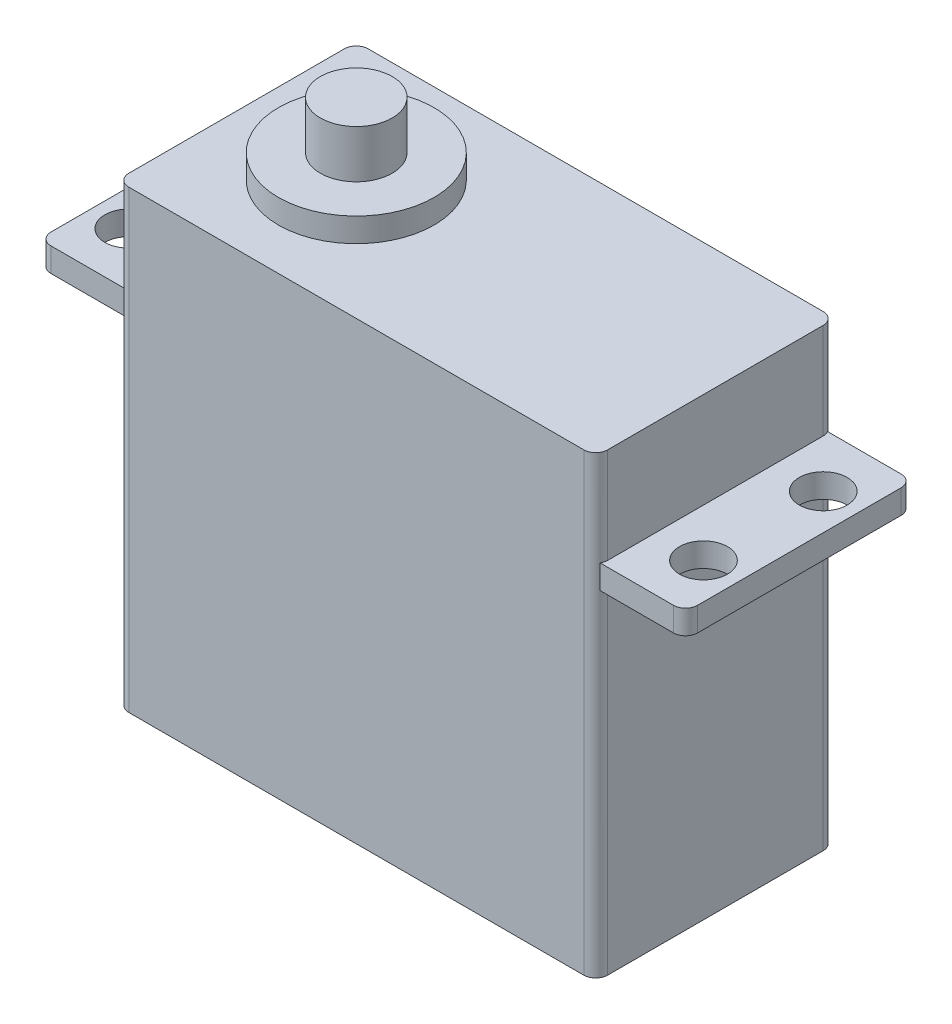
ISO-10303-21;
HEADER;
FILE_DESCRIPTION(('STEP AP214'),'2;1');
FILE_NAME('part.step','',(''),(''),'','','');
FILE_SCHEMA(('AUTOMOTIVE_DESIGN { 1 0 10303 214 1 1 1 1 }'));
ENDSEC;
DATA;
#1=APPLICATION_CONTEXT('core data for automotive mechanical design processes');
#2=APPLICATION_PROTOCOL_DEFINITION('international standard','automotive_design',2000,#1);
#3=PRODUCT_CONTEXT('',#1,'mechanical');
#4=PRODUCT('Part','Part','',(#3));
#5=PRODUCT_RELATED_PRODUCT_CATEGORY('part','',(#4));
#6=PRODUCT_DEFINITION_FORMATION('','',#4);
#7=PRODUCT_DEFINITION_CONTEXT('part definition',#1,'design');
#8=PRODUCT_DEFINITION('design','',#6,#7);
#9=PRODUCT_DEFINITION_SHAPE('','',#8);
#10=(LENGTH_UNIT() NAMED_UNIT(*) SI_UNIT(.MILLI.,.METRE.));
#11=(NAMED_UNIT(*) PLANE_ANGLE_UNIT() SI_UNIT($,.RADIAN.));
#12=(NAMED_UNIT(*) SI_UNIT($,.STERADIAN.) SOLID_ANGLE_UNIT());
#13=UNCERTAINTY_MEASURE_WITH_UNIT(LENGTH_MEASURE(1.E-05),#10,'distance_accuracy_value','');
#14=(GEOMETRIC_REPRESENTATION_CONTEXT(3) GLOBAL_UNCERTAINTY_ASSIGNED_CONTEXT((#13)) GLOBAL_UNIT_ASSIGNED_CONTEXT((#10,
#11,#12)) REPRESENTATION_CONTEXT('',''));
#15=CARTESIAN_POINT('',(0.,0.,0.));
#16=DIRECTION('',(0.,0.,1.));
#17=DIRECTION('',(1.,0.,0.));
#18=AXIS2_PLACEMENT_3D('',#15,#16,#17);
#19=CARTESIAN_POINT('',(-10.,-38.,-10.));
#20=DIRECTION('',(-1.,0.,0.));
#21=DIRECTION('',(0.,0.,1.));
#22=AXIS2_PLACEMENT_3D('',#19,#20,#21);
#23=PLANE('',#22);
#24=DIRECTION('',(0.,0.,1.));
#25=VECTOR('',#24,1.);
#26=CARTESIAN_POINT('',(-10.,-35.,-3.));
#27=LINE('',#26,#25);
#28=CARTESIAN_POINT('',(-10.,-35.,-3.));
#29=VERTEX_POINT('',#28);
#30=CARTESIAN_POINT('',(-10.,-35.,3.));
#31=VERTEX_POINT('',#30);
#32=EDGE_CURVE('E935',#29,#31,#27,.T.);
#33=ORIENTED_EDGE('',*,*,#32,.F.);
#34=DIRECTION('',(0.,-1.,0.));
#35=VECTOR('',#34,1.);
#36=CARTESIAN_POINT('',(-10.,-31.,-3.));
#37=LINE('',#36,#35);
#38=CARTESIAN_POINT('',(-10.,-31.,-3.));
#39=VERTEX_POINT('',#38);
#40=EDGE_CURVE('E241',#39,#29,#37,.T.);
#41=ORIENTED_EDGE('',*,*,#40,.F.);
#42=DIRECTION('',(0.,0.,-1.));
#43=VECTOR('',#42,1.);
#44=CARTESIAN_POINT('',(-10.,-31.,-3.));
#45=LINE('',#44,#43);
#46=CARTESIAN_POINT('',(-10.,-31.,3.00000000000001));
#47=VERTEX_POINT('',#46);
#48=EDGE_CURVE('E237',#47,#39,#45,.T.);
#49=ORIENTED_EDGE('',*,*,#48,.F.);
#50=DIRECTION('',(0.,1.,0.));
#51=VECTOR('',#50,1.);
#52=CARTESIAN_POINT('',(-10.,-31.,3.));
#53=LINE('',#52,#51);
#54=EDGE_CURVE('E933',#31,#47,#53,.T.);
#55=ORIENTED_EDGE('',*,*,#54,.F.);
#56=EDGE_LOOP('',(#33,#41,#49,#55));
#57=FACE_BOUND('',#56,.T.);
#58=DIRECTION('',(0.,0.,1.));
#59=VECTOR('',#58,1.);
#60=CARTESIAN_POINT('',(-10.,-38.,-10.));
#61=LINE('',#60,#59);
#62=CARTESIAN_POINT('',(-10.,-38.,-9.));
#63=VERTEX_POINT('',#62);
#64=CARTESIAN_POINT('',(-10.,-38.,9.));
#65=VERTEX_POINT('',#64);
#66=EDGE_CURVE('E323',#63,#65,#61,.T.);
#67=ORIENTED_EDGE('',*,*,#66,.T.);
#68=DIRECTION('',(0.,1.,0.));
#69=VECTOR('',#68,1.);
#70=CARTESIAN_POINT('',(-10.,-38.,9.));
#71=LINE('',#70,#69);
#72=CARTESIAN_POINT('',(-10.,-10.,9.));
#73=VERTEX_POINT('',#72);
#74=EDGE_CURVE('E423',#65,#73,#71,.T.);
#75=ORIENTED_EDGE('',*,*,#74,.T.);
#76=DIRECTION('',(0.,0.,1.));
#77=VECTOR('',#76,1.);
#78=CARTESIAN_POINT('',(-10.,-10.,-9.5));
#79=LINE('',#78,#77);
#80=CARTESIAN_POINT('',(-10.,-10.,-9.));
#81=VERTEX_POINT('',#80);
#82=EDGE_CURVE('E272',#81,#73,#79,.T.);
#83=ORIENTED_EDGE('',*,*,#82,.F.);
#84=DIRECTION('',(0.,1.,0.));
#85=VECTOR('',#84,1.);
#86=CARTESIAN_POINT('',(-10.,-38.,-9.));
#87=LINE('',#86,#85);
#88=EDGE_CURVE('E417',#81,#63,#87,.F.);
#89=ORIENTED_EDGE('',*,*,#88,.T.);
#90=EDGE_LOOP('',(#67,#75,#83,#89));
#91=FACE_BOUND('',#90,.T.);
#92=ADVANCED_FACE('F34',(#57,#91),#23,.T.);
#93=CARTESIAN_POINT('',(30.,-38.,-10.));
#94=DIRECTION('',(1.,0.,0.));
#95=DIRECTION('',(0.,0.,-1.));
#96=AXIS2_PLACEMENT_3D('',#93,#94,#95);
#97=PLANE('',#96);
#98=DIRECTION('',(0.,0.,-1.));
#99=VECTOR('',#98,1.);
#100=CARTESIAN_POINT('',(30.,-38.,-10.));
#101=LINE('',#100,#99);
#102=CARTESIAN_POINT('',(30.,-38.,9.));
#103=VERTEX_POINT('',#102);
#104=CARTESIAN_POINT('',(30.,-38.,-9.));
#105=VERTEX_POINT('',#104);
#106=EDGE_CURVE('E330',#103,#105,#101,.T.);
#107=ORIENTED_EDGE('',*,*,#106,.T.);
#108=DIRECTION('',(0.,1.,0.));
#109=VECTOR('',#108,1.);
#110=CARTESIAN_POINT('',(30.,-38.,-9.));
#111=LINE('',#110,#109);
#112=CARTESIAN_POINT('',(30.,-10.,-9.));
#113=VERTEX_POINT('',#112);
#114=EDGE_CURVE('E368',#105,#113,#111,.T.);
#115=ORIENTED_EDGE('',*,*,#114,.T.);
#116=DIRECTION('',(0.,0.,-1.));
#117=VECTOR('',#116,1.);
#118=CARTESIAN_POINT('',(30.,-10.,9.5));
#119=LINE('',#118,#117);
#120=CARTESIAN_POINT('',(30.,-10.,9.));
#121=VERTEX_POINT('',#120);
#122=EDGE_CURVE('E290',#121,#113,#119,.T.);
#123=ORIENTED_EDGE('',*,*,#122,.F.);
#124=DIRECTION('',(0.,1.,0.));
#125=VECTOR('',#124,1.);
#126=CARTESIAN_POINT('',(30.,-38.,9.));
#127=LINE('',#126,#125);
#128=EDGE_CURVE('E362',#121,#103,#127,.F.);
#129=ORIENTED_EDGE('',*,*,#128,.T.);
#130=EDGE_LOOP('',(#107,#115,#123,#129));
#131=FACE_BOUND('',#130,.T.);
#132=ADVANCED_FACE('F500',(#131),#97,.T.);
#133=DIRECTION('',(0.,0.,-1.));
#134=VECTOR('',#133,1.);
#135=CARTESIAN_POINT('',(-10.,-8.,-9.5));
#136=LINE('',#135,#134);
#137=CARTESIAN_POINT('',(-10.,-8.,9.00000000000001));
#138=VERTEX_POINT('',#137);
#139=CARTESIAN_POINT('',(-10.,-8.,-9.));
#140=VERTEX_POINT('',#139);
#141=EDGE_CURVE('E277',#138,#140,#136,.T.);
#142=ORIENTED_EDGE('',*,*,#141,.F.);
#143=DIRECTION('',(0.,1.,0.));
#144=VECTOR('',#143,1.);
#145=CARTESIAN_POINT('',(-10.,-38.,9.));
#146=LINE('',#145,#144);
#147=CARTESIAN_POINT('',(-10.,0.,9.));
#148=VERTEX_POINT('',#147);
#149=EDGE_CURVE('E421',#138,#148,#146,.T.);
#150=ORIENTED_EDGE('',*,*,#149,.T.);
#151=DIRECTION('',(0.,0.,1.));
#152=VECTOR('',#151,1.);
#153=CARTESIAN_POINT('',(-10.,0.,-10.));
#154=LINE('',#153,#152);
#155=CARTESIAN_POINT('',(-10.,0.,-9.));
#156=VERTEX_POINT('',#155);
#157=EDGE_CURVE('E320',#156,#148,#154,.T.);
#158=ORIENTED_EDGE('',*,*,#157,.F.);
#159=DIRECTION('',(0.,1.,0.));
#160=VECTOR('',#159,1.);
#161=CARTESIAN_POINT('',(-10.,-38.,-9.));
#162=LINE('',#161,#160);
#163=EDGE_CURVE('E419',#156,#140,#162,.F.);
#164=ORIENTED_EDGE('',*,*,#163,.T.);
#165=EDGE_LOOP('',(#142,#150,#158,#164));
#166=FACE_BOUND('',#165,.T.);
#167=ADVANCED_FACE('F503',(#166),#23,.T.);
#168=DIRECTION('',(0.,0.,1.));
#169=VECTOR('',#168,1.);
#170=CARTESIAN_POINT('',(30.,-8.,9.5));
#171=LINE('',#170,#169);
#172=CARTESIAN_POINT('',(30.,-8.,-9.));
#173=VERTEX_POINT('',#172);
#174=CARTESIAN_POINT('',(30.,-8.,9.));
#175=VERTEX_POINT('',#174);
#176=EDGE_CURVE('E295',#173,#175,#171,.T.);
#177=ORIENTED_EDGE('',*,*,#176,.F.);
#178=DIRECTION('',(0.,1.,0.));
#179=VECTOR('',#178,1.);
#180=CARTESIAN_POINT('',(30.,-38.,-9.));
#181=LINE('',#180,#179);
#182=CARTESIAN_POINT('',(30.,0.,-9.));
#183=VERTEX_POINT('',#182);
#184=EDGE_CURVE('E366',#173,#183,#181,.T.);
#185=ORIENTED_EDGE('',*,*,#184,.T.);
#186=DIRECTION('',(0.,0.,-1.));
#187=VECTOR('',#186,1.);
#188=CARTESIAN_POINT('',(30.,0.,-10.));
#189=LINE('',#188,#187);
#190=CARTESIAN_POINT('',(30.,0.,9.));
#191=VERTEX_POINT('',#190);
#192=EDGE_CURVE('E342',#191,#183,#189,.T.);
#193=ORIENTED_EDGE('',*,*,#192,.F.);
#194=DIRECTION('',(0.,1.,0.));
#195=VECTOR('',#194,1.);
#196=CARTESIAN_POINT('',(30.,-38.,9.));
#197=LINE('',#196,#195);
#198=EDGE_CURVE('E364',#191,#175,#197,.F.);
#199=ORIENTED_EDGE('',*,*,#198,.T.);
#200=EDGE_LOOP('',(#177,#185,#193,#199));
#201=FACE_BOUND('',#200,.T.);
#202=ADVANCED_FACE('F509',(#201),#97,.T.);
#203=CARTESIAN_POINT('',(-10.,-38.,-10.));
#204=DIRECTION('',(0.,0.,-1.));
#205=DIRECTION('',(-1.,0.,0.));
#206=AXIS2_PLACEMENT_3D('',#203,#204,#205);
#207=PLANE('',#206);
#208=DIRECTION('',(-1.,0.,0.));
#209=VECTOR('',#208,1.);
#210=CARTESIAN_POINT('',(-10.,0.,-10.));
#211=LINE('',#210,#209);
#212=CARTESIAN_POINT('',(29.,0.,-10.));
#213=VERTEX_POINT('',#212);
#214=CARTESIAN_POINT('',(-9.,0.,-10.));
#215=VERTEX_POINT('',#214);
#216=EDGE_CURVE('E327',#213,#215,#211,.T.);
#217=ORIENTED_EDGE('',*,*,#216,.F.);
#218=DIRECTION('',(0.,1.,0.));
#219=VECTOR('',#218,1.);
#220=CARTESIAN_POINT('',(29.,-38.,-10.));
#221=LINE('',#220,#219);
#222=CARTESIAN_POINT('',(29.,-38.,-10.));
#223=VERTEX_POINT('',#222);
#224=EDGE_CURVE('E382',#213,#223,#221,.F.);
#225=ORIENTED_EDGE('',*,*,#224,.T.);
#226=DIRECTION('',(-1.,0.,0.));
#227=VECTOR('',#226,1.);
#228=CARTESIAN_POINT('',(-10.,-38.,-10.));
#229=LINE('',#228,#227);
#230=CARTESIAN_POINT('',(-9.,-38.,-10.));
#231=VERTEX_POINT('',#230);
#232=EDGE_CURVE('E333',#223,#231,#229,.T.);
#233=ORIENTED_EDGE('',*,*,#232,.T.);
#234=DIRECTION('',(0.,1.,0.));
#235=VECTOR('',#234,1.);
#236=CARTESIAN_POINT('',(-9.,-38.,-10.));
#237=LINE('',#236,#235);
#238=EDGE_CURVE('E379',#231,#215,#237,.T.);
#239=ORIENTED_EDGE('',*,*,#238,.T.);
#240=EDGE_LOOP('',(#217,#225,#233,#239));
#241=FACE_BOUND('',#240,.T.);
#242=ADVANCED_FACE('F517',(#241),#207,.T.);
#243=CARTESIAN_POINT('',(-10.,-38.,10.));
#244=DIRECTION('',(0.,0.,1.));
#245=DIRECTION('',(1.,0.,0.));
#246=AXIS2_PLACEMENT_3D('',#243,#244,#245);
#247=PLANE('',#246);
#248=DIRECTION('',(1.,0.,0.));
#249=VECTOR('',#248,1.);
#250=CARTESIAN_POINT('',(-10.,-38.,10.));
#251=LINE('',#250,#249);
#252=CARTESIAN_POINT('',(-9.,-38.,10.));
#253=VERTEX_POINT('',#252);
#254=CARTESIAN_POINT('',(29.,-38.,10.));
#255=VERTEX_POINT('',#254);
#256=EDGE_CURVE('E326',#253,#255,#251,.T.);
#257=ORIENTED_EDGE('',*,*,#256,.T.);
#258=DIRECTION('',(0.,1.,0.));
#259=VECTOR('',#258,1.);
#260=CARTESIAN_POINT('',(29.,-38.,10.));
#261=LINE('',#260,#259);
#262=CARTESIAN_POINT('',(29.,0.,10.));
#263=VERTEX_POINT('',#262);
#264=EDGE_CURVE('E396',#255,#263,#261,.T.);
#265=ORIENTED_EDGE('',*,*,#264,.T.);
#266=DIRECTION('',(1.,0.,0.));
#267=VECTOR('',#266,1.);
#268=CARTESIAN_POINT('',(-10.,0.,10.));
#269=LINE('',#268,#267);
#270=CARTESIAN_POINT('',(-9.,0.,10.));
#271=VERTEX_POINT('',#270);
#272=EDGE_CURVE('E339',#271,#263,#269,.T.);
#273=ORIENTED_EDGE('',*,*,#272,.F.);
#274=DIRECTION('',(0.,1.,0.));
#275=VECTOR('',#274,1.);
#276=CARTESIAN_POINT('',(-9.,-38.,10.));
#277=LINE('',#276,#275);
#278=EDGE_CURVE('E394',#271,#253,#277,.F.);
#279=ORIENTED_EDGE('',*,*,#278,.T.);
#280=EDGE_LOOP('',(#257,#265,#273,#279));
#281=FACE_BOUND('',#280,.T.);
#282=ADVANCED_FACE('F528',(#281),#247,.T.);
#283=CARTESIAN_POINT('',(0.,-38.,0.));
#284=DIRECTION('',(0.,1.,0.));
#285=DIRECTION('',(0.,0.,1.));
#286=AXIS2_PLACEMENT_3D('',#283,#284,#285);
#287=PLANE('',#286);
#288=ORIENTED_EDGE('',*,*,#232,.F.);
#289=CARTESIAN_POINT('',(29.,-38.,-9.));
#290=DIRECTION('',(0.,1.,0.));
#291=DIRECTION('',(0.,0.,1.));
#292=AXIS2_PLACEMENT_3D('',#289,#290,#291);
#293=CIRCLE('',#292,1.);
#294=EDGE_CURVE('E390',#223,#105,#293,.F.);
#295=ORIENTED_EDGE('',*,*,#294,.T.);
#296=ORIENTED_EDGE('',*,*,#106,.F.);
#297=CARTESIAN_POINT('',(29.,-38.,9.));
#298=DIRECTION('',(0.,1.,0.));
#299=DIRECTION('',(0.,0.,1.));
#300=AXIS2_PLACEMENT_3D('',#297,#298,#299);
#301=CIRCLE('',#300,1.);
#302=EDGE_CURVE('E388',#103,#255,#301,.F.);
#303=ORIENTED_EDGE('',*,*,#302,.T.);
#304=ORIENTED_EDGE('',*,*,#256,.F.);
#305=CARTESIAN_POINT('',(-9.,-38.,9.));
#306=DIRECTION('',(0.,1.,0.));
#307=DIRECTION('',(0.,0.,1.));
#308=AXIS2_PLACEMENT_3D('',#305,#306,#307);
#309=CIRCLE('',#308,1.);
#310=EDGE_CURVE('E386',#253,#65,#309,.F.);
#311=ORIENTED_EDGE('',*,*,#310,.T.);
#312=ORIENTED_EDGE('',*,*,#66,.F.);
#313=CARTESIAN_POINT('',(-9.,-38.,-9.));
#314=DIRECTION('',(0.,1.,0.));
#315=DIRECTION('',(0.,0.,1.));
#316=AXIS2_PLACEMENT_3D('',#313,#314,#315);
#317=CIRCLE('',#316,1.);
#318=EDGE_CURVE('E384',#63,#231,#317,.F.);
#319=ORIENTED_EDGE('',*,*,#318,.T.);
#320=EDGE_LOOP('',(#288,#295,#296,#303,#304,#311,#312,#319));
#321=FACE_BOUND('',#320,.T.);
#322=ADVANCED_FACE('F550',(#321),#287,.F.);
#323=CARTESIAN_POINT('',(0.,0.,0.));
#324=DIRECTION('',(0.,1.,0.));
#325=DIRECTION('',(0.,0.,1.));
#326=AXIS2_PLACEMENT_3D('',#323,#324,#325);
#327=PLANE('',#326);
#328=CARTESIAN_POINT('',(0.,0.,0.));
#329=DIRECTION('',(0.,1.,0.));
#330=DIRECTION('',(0.,0.,1.));
#331=AXIS2_PLACEMENT_3D('',#328,#329,#330);
#332=CIRCLE('',#331,6.5);
#333=CARTESIAN_POINT('',(0.,0.,6.5));
#334=VERTEX_POINT('',#333);
#335=EDGE_CURVE('E314',#334,#334,#332,.T.);
#336=ORIENTED_EDGE('',*,*,#335,.F.);
#337=EDGE_LOOP('',(#336));
#338=FACE_BOUND('',#337,.T.);
#339=ORIENTED_EDGE('',*,*,#192,.T.);
#340=CARTESIAN_POINT('',(29.,0.,-9.));
#341=DIRECTION('',(0.,1.,0.));
#342=DIRECTION('',(0.,0.,1.));
#343=AXIS2_PLACEMENT_3D('',#340,#341,#342);
#344=CIRCLE('',#343,1.);
#345=EDGE_CURVE('E377',#183,#213,#344,.T.);
#346=ORIENTED_EDGE('',*,*,#345,.T.);
#347=ORIENTED_EDGE('',*,*,#216,.T.);
#348=CARTESIAN_POINT('',(-9.,0.,-9.));
#349=DIRECTION('',(0.,1.,0.));
#350=DIRECTION('',(0.,0.,1.));
#351=AXIS2_PLACEMENT_3D('',#348,#349,#350);
#352=CIRCLE('',#351,1.);
#353=EDGE_CURVE('E371',#215,#156,#352,.T.);
#354=ORIENTED_EDGE('',*,*,#353,.T.);
#355=ORIENTED_EDGE('',*,*,#157,.T.);
#356=CARTESIAN_POINT('',(-9.,0.,9.));
#357=DIRECTION('',(0.,1.,0.));
#358=DIRECTION('',(0.,0.,1.));
#359=AXIS2_PLACEMENT_3D('',#356,#357,#358);
#360=CIRCLE('',#359,1.);
#361=EDGE_CURVE('E373',#148,#271,#360,.T.);
#362=ORIENTED_EDGE('',*,*,#361,.T.);
#363=ORIENTED_EDGE('',*,*,#272,.T.);
#364=CARTESIAN_POINT('',(29.,0.,9.));
#365=DIRECTION('',(0.,1.,0.));
#366=DIRECTION('',(0.,0.,1.));
#367=AXIS2_PLACEMENT_3D('',#364,#365,#366);
#368=CIRCLE('',#367,1.);
#369=EDGE_CURVE('E375',#263,#191,#368,.T.);
#370=ORIENTED_EDGE('',*,*,#369,.T.);
#371=EDGE_LOOP('',(#339,#346,#347,#354,#355,#362,#363,#370));
#372=FACE_BOUND('',#371,.T.);
#373=ADVANCED_FACE('F526',(#338,#372),#327,.T.);
#374=CARTESIAN_POINT('',(0.,2.,0.));
#375=DIRECTION('',(0.,-1.,0.));
#376=DIRECTION('',(0.,0.,-1.));
#377=AXIS2_PLACEMENT_3D('',#374,#375,#376);
#378=CYLINDRICAL_SURFACE('',#377,6.5);
#379=CARTESIAN_POINT('',(0.,2.,0.));
#380=DIRECTION('',(0.,1.,0.));
#381=DIRECTION('',(0.,0.,1.));
#382=AXIS2_PLACEMENT_3D('',#379,#380,#381);
#383=CIRCLE('',#382,6.5);
#384=CARTESIAN_POINT('',(0.,2.,6.5));
#385=VERTEX_POINT('',#384);
#386=EDGE_CURVE('E317',#385,#385,#383,.T.);
#387=ORIENTED_EDGE('',*,*,#386,.F.);
#388=EDGE_LOOP('',(#387));
#389=FACE_BOUND('',#388,.T.);
#390=ORIENTED_EDGE('',*,*,#335,.T.);
#391=EDGE_LOOP('',(#390));
#392=FACE_BOUND('',#391,.T.);
#393=ADVANCED_FACE('F659',(#389,#392),#378,.T.);
#394=CARTESIAN_POINT('',(0.,2.,0.));
#395=DIRECTION('',(0.,1.,0.));
#396=DIRECTION('',(0.,0.,1.));
#397=AXIS2_PLACEMENT_3D('',#394,#395,#396);
#398=PLANE('',#397);
#399=CARTESIAN_POINT('',(0.,2.,0.));
#400=DIRECTION('',(0.,1.,0.));
#401=DIRECTION('',(0.,0.,1.));
#402=AXIS2_PLACEMENT_3D('',#399,#400,#401);
#403=CIRCLE('',#402,3.);
#404=CARTESIAN_POINT('',(0.,2.,3.));
#405=VERTEX_POINT('',#404);
#406=EDGE_CURVE('E310',#405,#405,#403,.T.);
#407=ORIENTED_EDGE('',*,*,#406,.F.);
#408=EDGE_LOOP('',(#407));
#409=FACE_BOUND('',#408,.T.);
#410=ORIENTED_EDGE('',*,*,#386,.T.);
#411=EDGE_LOOP('',(#410));
#412=FACE_BOUND('',#411,.T.);
#413=ADVANCED_FACE('F655',(#409,#412),#398,.T.);
#414=CARTESIAN_POINT('',(0.,6.,0.));
#415=DIRECTION('',(0.,-1.,0.));
#416=DIRECTION('',(0.,0.,-1.));
#417=AXIS2_PLACEMENT_3D('',#414,#415,#416);
#418=CYLINDRICAL_SURFACE('',#417,3.);
#419=CARTESIAN_POINT('',(0.,6.,0.));
#420=DIRECTION('',(0.,1.,0.));
#421=DIRECTION('',(0.,0.,1.));
#422=AXIS2_PLACEMENT_3D('',#419,#420,#421);
#423=CIRCLE('',#422,3.);
#424=CARTESIAN_POINT('',(0.,6.,3.));
#425=VERTEX_POINT('',#424);
#426=EDGE_CURVE('E311',#425,#425,#423,.T.);
#427=ORIENTED_EDGE('',*,*,#426,.F.);
#428=EDGE_LOOP('',(#427));
#429=FACE_BOUND('',#428,.T.);
#430=ORIENTED_EDGE('',*,*,#406,.T.);
#431=EDGE_LOOP('',(#430));
#432=FACE_BOUND('',#431,.T.);
#433=ADVANCED_FACE('F651',(#429,#432),#418,.T.);
#434=CARTESIAN_POINT('',(0.,6.,0.));
#435=DIRECTION('',(0.,1.,0.));
#436=DIRECTION('',(0.,0.,1.));
#437=AXIS2_PLACEMENT_3D('',#434,#435,#436);
#438=PLANE('',#437);
#439=ORIENTED_EDGE('',*,*,#426,.T.);
#440=EDGE_LOOP('',(#439));
#441=FACE_BOUND('',#440,.T.);
#442=ADVANCED_FACE('F648',(#441),#438,.T.);
#443=CARTESIAN_POINT('',(37.,-8.,9.5));
#444=DIRECTION('',(0.,0.,-1.));
#445=DIRECTION('',(-1.,0.,0.));
#446=AXIS2_PLACEMENT_3D('',#443,#444,#445);
#447=PLANE('',#446);
#448=DIRECTION('',(-1.,0.,0.));
#449=VECTOR('',#448,1.);
#450=CARTESIAN_POINT('',(37.,-10.,9.5));
#451=LINE('',#450,#449);
#452=CARTESIAN_POINT('',(36.,-10.,9.5));
#453=VERTEX_POINT('',#452);
#454=CARTESIAN_POINT('',(29.8660254037844,-10.,9.5));
#455=VERTEX_POINT('',#454);
#456=EDGE_CURVE('E308',#453,#455,#451,.T.);
#457=ORIENTED_EDGE('',*,*,#456,.F.);
#458=DIRECTION('',(0.,-1.,0.));
#459=VECTOR('',#458,1.);
#460=CARTESIAN_POINT('',(36.,-8.,9.5));
#461=LINE('',#460,#459);
#462=CARTESIAN_POINT('',(36.,-8.,9.5));
#463=VERTEX_POINT('',#462);
#464=EDGE_CURVE('E392',#453,#463,#461,.F.);
#465=ORIENTED_EDGE('',*,*,#464,.T.);
#466=DIRECTION('',(-1.,0.,0.));
#467=VECTOR('',#466,1.);
#468=CARTESIAN_POINT('',(37.,-8.,9.5));
#469=LINE('',#468,#467);
#470=CARTESIAN_POINT('',(29.8660254037844,-8.,9.5));
#471=VERTEX_POINT('',#470);
#472=EDGE_CURVE('E298',#463,#471,#469,.T.);
#473=ORIENTED_EDGE('',*,*,#472,.T.);
#474=DIRECTION('',(0.,1.,0.));
#475=VECTOR('',#474,1.);
#476=CARTESIAN_POINT('',(29.8660254037844,-8.,9.5));
#477=LINE('',#476,#475);
#478=EDGE_CURVE('E437',#471,#455,#477,.F.);
#479=ORIENTED_EDGE('',*,*,#478,.T.);
#480=EDGE_LOOP('',(#457,#465,#473,#479));
#481=FACE_BOUND('',#480,.T.);
#482=ADVANCED_FACE('F562',(#481),#447,.F.);
#483=CARTESIAN_POINT('',(37.,-10.,9.5));
#484=DIRECTION('',(0.,1.,0.));
#485=DIRECTION('',(0.,0.,1.));
#486=AXIS2_PLACEMENT_3D('',#483,#484,#485);
#487=PLANE('',#486);
#488=CARTESIAN_POINT('',(34.,-10.,5.));
#489=DIRECTION('',(0.,1.,0.));
#490=DIRECTION('',(0.,0.,1.));
#491=AXIS2_PLACEMENT_3D('',#488,#489,#490);
#492=CIRCLE('',#491,2.);
#493=CARTESIAN_POINT('',(34.,-10.,7.));
#494=VERTEX_POINT('',#493);
#495=EDGE_CURVE('E263',#494,#494,#492,.T.);
#496=ORIENTED_EDGE('',*,*,#495,.T.);
#497=EDGE_LOOP('',(#496));
#498=FACE_BOUND('',#497,.T.);
#499=CARTESIAN_POINT('',(34.,-10.,-5.));
#500=DIRECTION('',(0.,1.,0.));
#501=DIRECTION('',(0.,0.,1.));
#502=AXIS2_PLACEMENT_3D('',#499,#500,#501);
#503=CIRCLE('',#502,2.);
#504=CARTESIAN_POINT('',(34.,-10.,-3.));
#505=VERTEX_POINT('',#504);
#506=EDGE_CURVE('E269',#505,#505,#503,.T.);
#507=ORIENTED_EDGE('',*,*,#506,.T.);
#508=EDGE_LOOP('',(#507));
#509=FACE_BOUND('',#508,.T.);
#510=DIRECTION('',(-1.,0.,0.));
#511=VECTOR('',#510,1.);
#512=CARTESIAN_POINT('',(37.,-10.,-9.5));
#513=LINE('',#512,#511);
#514=CARTESIAN_POINT('',(36.,-10.,-9.5));
#515=VERTEX_POINT('',#514);
#516=CARTESIAN_POINT('',(29.8660254037844,-10.,-9.5));
#517=VERTEX_POINT('',#516);
#518=EDGE_CURVE('E306',#515,#517,#513,.T.);
#519=ORIENTED_EDGE('',*,*,#518,.F.);
#520=CARTESIAN_POINT('',(36.,-10.,-8.5));
#521=DIRECTION('',(0.,1.,0.));
#522=DIRECTION('',(0.,0.,1.));
#523=AXIS2_PLACEMENT_3D('',#520,#521,#522);
#524=CIRCLE('',#523,1.);
#525=CARTESIAN_POINT('',(37.,-10.,-8.5));
#526=VERTEX_POINT('',#525);
#527=EDGE_CURVE('E360',#515,#526,#524,.F.);
#528=ORIENTED_EDGE('',*,*,#527,.T.);
#529=DIRECTION('',(0.,0.,-1.));
#530=VECTOR('',#529,1.);
#531=CARTESIAN_POINT('',(37.,-10.,9.5));
#532=LINE('',#531,#530);
#533=CARTESIAN_POINT('',(37.,-10.,8.5));
#534=VERTEX_POINT('',#533);
#535=EDGE_CURVE('E291',#534,#526,#532,.T.);
#536=ORIENTED_EDGE('',*,*,#535,.F.);
#537=CARTESIAN_POINT('',(36.,-10.,8.5));
#538=DIRECTION('',(0.,1.,0.));
#539=DIRECTION('',(0.,0.,1.));
#540=AXIS2_PLACEMENT_3D('',#537,#538,#539);
#541=CIRCLE('',#540,1.);
#542=EDGE_CURVE('E358',#534,#453,#541,.F.);
#543=ORIENTED_EDGE('',*,*,#542,.T.);
#544=ORIENTED_EDGE('',*,*,#456,.T.);
#545=CARTESIAN_POINT('',(29.,-10.,9.));
#546=DIRECTION('',(0.,1.,0.));
#547=DIRECTION('',(0.,0.,1.));
#548=AXIS2_PLACEMENT_3D('',#545,#546,#547);
#549=CIRCLE('',#548,1.);
#550=EDGE_CURVE('E440',#455,#121,#549,.T.);
#551=ORIENTED_EDGE('',*,*,#550,.T.);
#552=ORIENTED_EDGE('',*,*,#122,.T.);
#553=CARTESIAN_POINT('',(29.,-10.,-9.));
#554=DIRECTION('',(0.,1.,0.));
#555=DIRECTION('',(0.,0.,1.));
#556=AXIS2_PLACEMENT_3D('',#553,#554,#555);
#557=CIRCLE('',#556,1.);
#558=EDGE_CURVE('E426',#113,#517,#557,.T.);
#559=ORIENTED_EDGE('',*,*,#558,.T.);
#560=EDGE_LOOP('',(#519,#528,#536,#543,#544,#551,#552,#559));
#561=FACE_BOUND('',#560,.T.);
#562=ADVANCED_FACE('F556',(#498,#509,#561),#487,.F.);
#563=CARTESIAN_POINT('',(37.,-8.,-9.5));
#564=DIRECTION('',(0.,0.,1.));
#565=DIRECTION('',(1.,0.,0.));
#566=AXIS2_PLACEMENT_3D('',#563,#564,#565);
#567=PLANE('',#566);
#568=DIRECTION('',(-1.,0.,0.));
#569=VECTOR('',#568,1.);
#570=CARTESIAN_POINT('',(37.,-8.,-9.5));
#571=LINE('',#570,#569);
#572=CARTESIAN_POINT('',(36.,-8.,-9.5));
#573=VERTEX_POINT('',#572);
#574=CARTESIAN_POINT('',(29.8660254037844,-8.,-9.5));
#575=VERTEX_POINT('',#574);
#576=EDGE_CURVE('E304',#573,#575,#571,.T.);
#577=ORIENTED_EDGE('',*,*,#576,.F.);
#578=DIRECTION('',(0.,1.,0.));
#579=VECTOR('',#578,1.);
#580=CARTESIAN_POINT('',(36.,-10.,-9.5));
#581=LINE('',#580,#579);
#582=EDGE_CURVE('E356',#573,#515,#581,.F.);
#583=ORIENTED_EDGE('',*,*,#582,.T.);
#584=ORIENTED_EDGE('',*,*,#518,.T.);
#585=DIRECTION('',(0.,1.,0.));
#586=VECTOR('',#585,1.);
#587=CARTESIAN_POINT('',(29.8660254037844,-10.,-9.5));
#588=LINE('',#587,#586);
#589=EDGE_CURVE('E429',#517,#575,#588,.T.);
#590=ORIENTED_EDGE('',*,*,#589,.T.);
#591=EDGE_LOOP('',(#577,#583,#584,#590));
#592=FACE_BOUND('',#591,.T.);
#593=ADVANCED_FACE('F572',(#592),#567,.F.);
#594=CARTESIAN_POINT('',(37.,-8.,9.5));
#595=DIRECTION('',(0.,-1.,0.));
#596=DIRECTION('',(0.,0.,-1.));
#597=AXIS2_PLACEMENT_3D('',#594,#595,#596);
#598=PLANE('',#597);
#599=CARTESIAN_POINT('',(34.,-8.,5.));
#600=DIRECTION('',(0.,1.,0.));
#601=DIRECTION('',(0.,0.,1.));
#602=AXIS2_PLACEMENT_3D('',#599,#600,#601);
#603=CIRCLE('',#602,2.);
#604=CARTESIAN_POINT('',(34.,-8.,7.));
#605=VERTEX_POINT('',#604);
#606=EDGE_CURVE('E260',#605,#605,#603,.T.);
#607=ORIENTED_EDGE('',*,*,#606,.F.);
#608=EDGE_LOOP('',(#607));
#609=FACE_BOUND('',#608,.T.);
#610=CARTESIAN_POINT('',(34.,-8.,-5.));
#611=DIRECTION('',(0.,1.,0.));
#612=DIRECTION('',(0.,0.,1.));
#613=AXIS2_PLACEMENT_3D('',#610,#611,#612);
#614=CIRCLE('',#613,2.);
#615=CARTESIAN_POINT('',(34.,-8.,-3.));
#616=VERTEX_POINT('',#615);
#617=EDGE_CURVE('E266',#616,#616,#614,.T.);
#618=ORIENTED_EDGE('',*,*,#617,.F.);
#619=EDGE_LOOP('',(#618));
#620=FACE_BOUND('',#619,.T.);
#621=DIRECTION('',(0.,0.,1.));
#622=VECTOR('',#621,1.);
#623=CARTESIAN_POINT('',(37.,-8.,9.5));
#624=LINE('',#623,#622);
#625=CARTESIAN_POINT('',(37.,-8.,-8.5));
#626=VERTEX_POINT('',#625);
#627=CARTESIAN_POINT('',(37.,-8.,8.5));
#628=VERTEX_POINT('',#627);
#629=EDGE_CURVE('E294',#626,#628,#624,.T.);
#630=ORIENTED_EDGE('',*,*,#629,.F.);
#631=CARTESIAN_POINT('',(36.,-8.,-8.5));
#632=DIRECTION('',(0.,-1.,0.));
#633=DIRECTION('',(0.,0.,-1.));
#634=AXIS2_PLACEMENT_3D('',#631,#632,#633);
#635=CIRCLE('',#634,1.);
#636=EDGE_CURVE('E354',#626,#573,#635,.F.);
#637=ORIENTED_EDGE('',*,*,#636,.T.);
#638=ORIENTED_EDGE('',*,*,#576,.T.);
#639=CARTESIAN_POINT('',(29.,-8.,-9.));
#640=DIRECTION('',(0.,-1.,0.));
#641=DIRECTION('',(0.,0.,-1.));
#642=AXIS2_PLACEMENT_3D('',#639,#640,#641);
#643=CIRCLE('',#642,1.);
#644=EDGE_CURVE('E432',#575,#173,#643,.T.);
#645=ORIENTED_EDGE('',*,*,#644,.T.);
#646=ORIENTED_EDGE('',*,*,#176,.T.);
#647=CARTESIAN_POINT('',(29.,-8.,9.));
#648=DIRECTION('',(0.,-1.,0.));
#649=DIRECTION('',(0.,0.,-1.));
#650=AXIS2_PLACEMENT_3D('',#647,#648,#649);
#651=CIRCLE('',#650,1.);
#652=EDGE_CURVE('E434',#175,#471,#651,.T.);
#653=ORIENTED_EDGE('',*,*,#652,.T.);
#654=ORIENTED_EDGE('',*,*,#472,.F.);
#655=CARTESIAN_POINT('',(36.,-8.,8.5));
#656=DIRECTION('',(0.,-1.,0.));
#657=DIRECTION('',(0.,0.,-1.));
#658=AXIS2_PLACEMENT_3D('',#655,#656,#657);
#659=CIRCLE('',#658,1.);
#660=EDGE_CURVE('E352',#463,#628,#659,.F.);
#661=ORIENTED_EDGE('',*,*,#660,.T.);
#662=EDGE_LOOP('',(#630,#637,#638,#645,#646,#653,#654,#661));
#663=FACE_BOUND('',#662,.T.);
#664=ADVANCED_FACE('F568',(#609,#620,#663),#598,.F.);
#665=CARTESIAN_POINT('',(37.,0.,0.));
#666=DIRECTION('',(1.,0.,0.));
#667=DIRECTION('',(0.,0.,-1.));
#668=AXIS2_PLACEMENT_3D('',#665,#666,#667);
#669=PLANE('',#668);
#670=ORIENTED_EDGE('',*,*,#535,.T.);
#671=DIRECTION('',(0.,1.,0.));
#672=VECTOR('',#671,1.);
#673=CARTESIAN_POINT('',(37.,-8.,-8.5));
#674=LINE('',#673,#672);
#675=EDGE_CURVE('E349',#526,#626,#674,.T.);
#676=ORIENTED_EDGE('',*,*,#675,.T.);
#677=ORIENTED_EDGE('',*,*,#629,.T.);
#678=DIRECTION('',(0.,-1.,0.));
#679=VECTOR('',#678,1.);
#680=CARTESIAN_POINT('',(37.,-10.,8.5));
#681=LINE('',#680,#679);
#682=EDGE_CURVE('E336',#628,#534,#681,.T.);
#683=ORIENTED_EDGE('',*,*,#682,.T.);
#684=EDGE_LOOP('',(#670,#676,#677,#683));
#685=FACE_BOUND('',#684,.T.);
#686=ADVANCED_FACE('F578',(#685),#669,.T.);
#687=CARTESIAN_POINT('',(-17.,-8.,-9.5));
#688=DIRECTION('',(0.,0.,1.));
#689=DIRECTION('',(0.,-1.,0.));
#690=AXIS2_PLACEMENT_3D('',#687,#688,#689);
#691=PLANE('',#690);
#692=DIRECTION('',(1.,0.,0.));
#693=VECTOR('',#692,1.);
#694=CARTESIAN_POINT('',(-17.,-10.,-9.5));
#695=LINE('',#694,#693);
#696=CARTESIAN_POINT('',(-16.,-10.,-9.5));
#697=VERTEX_POINT('',#696);
#698=CARTESIAN_POINT('',(-9.86602540378444,-10.,-9.5));
#699=VERTEX_POINT('',#698);
#700=EDGE_CURVE('E48',#697,#699,#695,.T.);
#701=ORIENTED_EDGE('',*,*,#700,.F.);
#702=DIRECTION('',(0.,-1.,0.));
#703=VECTOR('',#702,1.);
#704=CARTESIAN_POINT('',(-16.,-8.,-9.5));
#705=LINE('',#704,#703);
#706=CARTESIAN_POINT('',(-16.,-8.,-9.5));
#707=VERTEX_POINT('',#706);
#708=EDGE_CURVE('E409',#697,#707,#705,.F.);
#709=ORIENTED_EDGE('',*,*,#708,.T.);
#710=DIRECTION('',(1.,0.,0.));
#711=VECTOR('',#710,1.);
#712=CARTESIAN_POINT('',(-17.,-8.,-9.5));
#713=LINE('',#712,#711);
#714=CARTESIAN_POINT('',(-9.86602540378444,-8.,-9.5));
#715=VERTEX_POINT('',#714);
#716=EDGE_CURVE('E55',#707,#715,#713,.T.);
#717=ORIENTED_EDGE('',*,*,#716,.T.);
#718=DIRECTION('',(0.,1.,0.));
#719=VECTOR('',#718,1.);
#720=CARTESIAN_POINT('',(-9.86602540378444,-8.,-9.5));
#721=LINE('',#720,#719);
#722=EDGE_CURVE('E42',#715,#699,#721,.F.);
#723=ORIENTED_EDGE('',*,*,#722,.T.);
#724=EDGE_LOOP('',(#701,#709,#717,#723));
#725=FACE_BOUND('',#724,.T.);
#726=ADVANCED_FACE('F453',(#725),#691,.F.);
#727=CARTESIAN_POINT('',(-17.,-10.,-9.5));
#728=DIRECTION('',(0.,1.,0.));
#729=DIRECTION('',(0.,0.,1.));
#730=AXIS2_PLACEMENT_3D('',#727,#728,#729);
#731=PLANE('',#730);
#732=CARTESIAN_POINT('',(-14.,-10.,5.));
#733=DIRECTION('',(0.,1.,0.));
#734=DIRECTION('',(0.,0.,1.));
#735=AXIS2_PLACEMENT_3D('',#732,#733,#734);
#736=CIRCLE('',#735,2.);
#737=CARTESIAN_POINT('',(-14.,-10.,7.));
#738=VERTEX_POINT('',#737);
#739=EDGE_CURVE('E246',#738,#738,#736,.T.);
#740=ORIENTED_EDGE('',*,*,#739,.T.);
#741=EDGE_LOOP('',(#740));
#742=FACE_BOUND('',#741,.T.);
#743=CARTESIAN_POINT('',(-14.,-10.,-5.));
#744=DIRECTION('',(0.,1.,0.));
#745=DIRECTION('',(0.,0.,1.));
#746=AXIS2_PLACEMENT_3D('',#743,#744,#745);
#747=CIRCLE('',#746,2.);
#748=CARTESIAN_POINT('',(-14.,-10.,-3.));
#749=VERTEX_POINT('',#748);
#750=EDGE_CURVE('E257',#749,#749,#747,.T.);
#751=ORIENTED_EDGE('',*,*,#750,.T.);
#752=EDGE_LOOP('',(#751));
#753=FACE_BOUND('',#752,.T.);
#754=DIRECTION('',(0.,0.,1.));
#755=VECTOR('',#754,1.);
#756=CARTESIAN_POINT('',(-17.,-10.,-9.5));
#757=LINE('',#756,#755);
#758=CARTESIAN_POINT('',(-17.,-10.,-8.5));
#759=VERTEX_POINT('',#758);
#760=CARTESIAN_POINT('',(-17.,-10.,8.5));
#761=VERTEX_POINT('',#760);
#762=EDGE_CURVE('E273',#759,#761,#757,.T.);
#763=ORIENTED_EDGE('',*,*,#762,.F.);
#764=CARTESIAN_POINT('',(-16.,-10.,-8.5));
#765=DIRECTION('',(0.,1.,0.));
#766=DIRECTION('',(0.,0.,1.));
#767=AXIS2_PLACEMENT_3D('',#764,#765,#766);
#768=CIRCLE('',#767,1.);
#769=EDGE_CURVE('E407',#759,#697,#768,.F.);
#770=ORIENTED_EDGE('',*,*,#769,.T.);
#771=ORIENTED_EDGE('',*,*,#700,.T.);
#772=CARTESIAN_POINT('',(-9.,-10.,-9.));
#773=DIRECTION('',(0.,1.,0.));
#774=DIRECTION('',(0.,0.,1.));
#775=AXIS2_PLACEMENT_3D('',#772,#773,#774);
#776=CIRCLE('',#775,1.);
#777=EDGE_CURVE('E11',#699,#81,#776,.T.);
#778=ORIENTED_EDGE('',*,*,#777,.T.);
#779=ORIENTED_EDGE('',*,*,#82,.T.);
#780=CARTESIAN_POINT('',(-9.,-10.,9.));
#781=DIRECTION('',(0.,1.,0.));
#782=DIRECTION('',(0.,0.,1.));
#783=AXIS2_PLACEMENT_3D('',#780,#781,#782);
#784=CIRCLE('',#783,1.);
#785=CARTESIAN_POINT('',(-9.86602540378444,-10.,9.5));
#786=VERTEX_POINT('',#785);
#787=EDGE_CURVE('E442',#73,#786,#784,.T.);
#788=ORIENTED_EDGE('',*,*,#787,.T.);
#789=DIRECTION('',(1.,0.,0.));
#790=VECTOR('',#789,1.);
#791=CARTESIAN_POINT('',(-17.,-10.,9.5));
#792=LINE('',#791,#790);
#793=CARTESIAN_POINT('',(-16.,-10.,9.5));
#794=VERTEX_POINT('',#793);
#795=EDGE_CURVE('E287',#794,#786,#792,.T.);
#796=ORIENTED_EDGE('',*,*,#795,.F.);
#797=CARTESIAN_POINT('',(-16.,-10.,8.5));
#798=DIRECTION('',(0.,1.,0.));
#799=DIRECTION('',(0.,0.,1.));
#800=AXIS2_PLACEMENT_3D('',#797,#798,#799);
#801=CIRCLE('',#800,1.);
#802=EDGE_CURVE('E405',#794,#761,#801,.F.);
#803=ORIENTED_EDGE('',*,*,#802,.T.);
#804=EDGE_LOOP('',(#763,#770,#771,#778,#779,#788,#796,#803));
#805=FACE_BOUND('',#804,.T.);
#806=ADVANCED_FACE('F461',(#742,#753,#805),#731,.F.);
#807=CARTESIAN_POINT('',(-17.,-8.,9.5));
#808=DIRECTION('',(0.,0.,-1.));
#809=DIRECTION('',(-1.,0.,0.));
#810=AXIS2_PLACEMENT_3D('',#807,#808,#809);
#811=PLANE('',#810);
#812=DIRECTION('',(1.,0.,0.));
#813=VECTOR('',#812,1.);
#814=CARTESIAN_POINT('',(-17.,-8.,9.5));
#815=LINE('',#814,#813);
#816=CARTESIAN_POINT('',(-16.,-8.,9.5));
#817=VERTEX_POINT('',#816);
#818=CARTESIAN_POINT('',(-9.86602540378444,-8.,9.5));
#819=VERTEX_POINT('',#818);
#820=EDGE_CURVE('E285',#817,#819,#815,.T.);
#821=ORIENTED_EDGE('',*,*,#820,.F.);
#822=DIRECTION('',(0.,1.,0.));
#823=VECTOR('',#822,1.);
#824=CARTESIAN_POINT('',(-16.,-10.,9.5));
#825=LINE('',#824,#823);
#826=EDGE_CURVE('E415',#817,#794,#825,.F.);
#827=ORIENTED_EDGE('',*,*,#826,.T.);
#828=ORIENTED_EDGE('',*,*,#795,.T.);
#829=DIRECTION('',(0.,1.,0.));
#830=VECTOR('',#829,1.);
#831=CARTESIAN_POINT('',(-9.86602540378444,-10.,9.5));
#832=LINE('',#831,#830);
#833=EDGE_CURVE('E445',#786,#819,#832,.T.);
#834=ORIENTED_EDGE('',*,*,#833,.T.);
#835=EDGE_LOOP('',(#821,#827,#828,#834));
#836=FACE_BOUND('',#835,.T.);
#837=ADVANCED_FACE('F627',(#836),#811,.F.);
#838=CARTESIAN_POINT('',(-17.,-8.,-9.5));
#839=DIRECTION('',(0.,-1.,0.));
#840=DIRECTION('',(0.,0.,-1.));
#841=AXIS2_PLACEMENT_3D('',#838,#839,#840);
#842=PLANE('',#841);
#843=CARTESIAN_POINT('',(-14.,-8.,5.));
#844=DIRECTION('',(0.,1.,0.));
#845=DIRECTION('',(0.,0.,1.));
#846=AXIS2_PLACEMENT_3D('',#843,#844,#845);
#847=CIRCLE('',#846,2.);
#848=CARTESIAN_POINT('',(-14.,-8.,7.));
#849=VERTEX_POINT('',#848);
#850=EDGE_CURVE('E243',#849,#849,#847,.T.);
#851=ORIENTED_EDGE('',*,*,#850,.F.);
#852=EDGE_LOOP('',(#851));
#853=FACE_BOUND('',#852,.T.);
#854=CARTESIAN_POINT('',(-14.,-8.,-5.));
#855=DIRECTION('',(0.,1.,0.));
#856=DIRECTION('',(0.,0.,1.));
#857=AXIS2_PLACEMENT_3D('',#854,#855,#856);
#858=CIRCLE('',#857,2.);
#859=CARTESIAN_POINT('',(-14.,-8.,-3.));
#860=VERTEX_POINT('',#859);
#861=EDGE_CURVE('E254',#860,#860,#858,.T.);
#862=ORIENTED_EDGE('',*,*,#861,.F.);
#863=EDGE_LOOP('',(#862));
#864=FACE_BOUND('',#863,.T.);
#865=ORIENTED_EDGE('',*,*,#716,.F.);
#866=CARTESIAN_POINT('',(-16.,-8.,-8.5));
#867=DIRECTION('',(0.,-1.,0.));
#868=DIRECTION('',(0.,0.,-1.));
#869=AXIS2_PLACEMENT_3D('',#866,#867,#868);
#870=CIRCLE('',#869,1.);
#871=CARTESIAN_POINT('',(-17.,-8.,-8.5));
#872=VERTEX_POINT('',#871);
#873=EDGE_CURVE('E413',#707,#872,#870,.F.);
#874=ORIENTED_EDGE('',*,*,#873,.T.);
#875=DIRECTION('',(0.,0.,-1.));
#876=VECTOR('',#875,1.);
#877=CARTESIAN_POINT('',(-17.,-8.,-9.5));
#878=LINE('',#877,#876);
#879=CARTESIAN_POINT('',(-17.,-8.,8.5));
#880=VERTEX_POINT('',#879);
#881=EDGE_CURVE('E276',#880,#872,#878,.T.);
#882=ORIENTED_EDGE('',*,*,#881,.F.);
#883=CARTESIAN_POINT('',(-16.,-8.,8.5));
#884=DIRECTION('',(0.,-1.,0.));
#885=DIRECTION('',(0.,0.,-1.));
#886=AXIS2_PLACEMENT_3D('',#883,#884,#885);
#887=CIRCLE('',#886,1.);
#888=EDGE_CURVE('E411',#880,#817,#887,.F.);
#889=ORIENTED_EDGE('',*,*,#888,.T.);
#890=ORIENTED_EDGE('',*,*,#820,.T.);
#891=CARTESIAN_POINT('',(-9.,-8.,9.));
#892=DIRECTION('',(0.,-1.,0.));
#893=DIRECTION('',(0.,0.,-1.));
#894=AXIS2_PLACEMENT_3D('',#891,#892,#893);
#895=CIRCLE('',#894,1.);
#896=EDGE_CURVE('E448',#819,#138,#895,.T.);
#897=ORIENTED_EDGE('',*,*,#896,.T.);
#898=ORIENTED_EDGE('',*,*,#141,.T.);
#899=CARTESIAN_POINT('',(-9.,-8.,-9.));
#900=DIRECTION('',(0.,-1.,0.));
#901=DIRECTION('',(0.,0.,-1.));
#902=AXIS2_PLACEMENT_3D('',#899,#900,#901);
#903=CIRCLE('',#902,1.);
#904=EDGE_CURVE('E450',#140,#715,#903,.T.);
#905=ORIENTED_EDGE('',*,*,#904,.T.);
#906=EDGE_LOOP('',(#865,#874,#882,#889,#890,#897,#898,#905));
#907=FACE_BOUND('',#906,.T.);
#908=ADVANCED_FACE('F483',(#853,#864,#907),#842,.F.);
#909=CARTESIAN_POINT('',(-17.,0.,0.));
#910=DIRECTION('',(-1.,0.,0.));
#911=DIRECTION('',(0.,0.,1.));
#912=AXIS2_PLACEMENT_3D('',#909,#910,#911);
#913=PLANE('',#912);
#914=ORIENTED_EDGE('',*,*,#881,.T.);
#915=DIRECTION('',(0.,-1.,0.));
#916=VECTOR('',#915,1.);
#917=CARTESIAN_POINT('',(-17.,-10.,-8.5));
#918=LINE('',#917,#916);
#919=EDGE_CURVE('E402',#872,#759,#918,.T.);
#920=ORIENTED_EDGE('',*,*,#919,.T.);
#921=ORIENTED_EDGE('',*,*,#762,.T.);
#922=DIRECTION('',(0.,1.,0.));
#923=VECTOR('',#922,1.);
#924=CARTESIAN_POINT('',(-17.,-8.,8.5));
#925=LINE('',#924,#923);
#926=EDGE_CURVE('E399',#761,#880,#925,.T.);
#927=ORIENTED_EDGE('',*,*,#926,.T.);
#928=EDGE_LOOP('',(#914,#920,#921,#927));
#929=FACE_BOUND('',#928,.T.);
#930=ADVANCED_FACE('F480',(#929),#913,.T.);
#931=CARTESIAN_POINT('',(34.,-38.,-5.));
#932=DIRECTION('',(0.,1.,0.));
#933=DIRECTION('',(0.,0.,1.));
#934=AXIS2_PLACEMENT_3D('',#931,#932,#933);
#935=CYLINDRICAL_SURFACE('',#934,2.);
#936=ORIENTED_EDGE('',*,*,#617,.T.);
#937=EDGE_LOOP('',(#936));
#938=FACE_BOUND('',#937,.T.);
#939=ORIENTED_EDGE('',*,*,#506,.F.);
#940=EDGE_LOOP('',(#939));
#941=FACE_BOUND('',#940,.T.);
#942=ADVANCED_FACE('F618',(#938,#941),#935,.F.);
#943=CARTESIAN_POINT('',(34.,-38.,5.));
#944=DIRECTION('',(0.,1.,0.));
#945=DIRECTION('',(0.,0.,1.));
#946=AXIS2_PLACEMENT_3D('',#943,#944,#945);
#947=CYLINDRICAL_SURFACE('',#946,2.);
#948=ORIENTED_EDGE('',*,*,#606,.T.);
#949=EDGE_LOOP('',(#948));
#950=FACE_BOUND('',#949,.T.);
#951=ORIENTED_EDGE('',*,*,#495,.F.);
#952=EDGE_LOOP('',(#951));
#953=FACE_BOUND('',#952,.T.);
#954=ADVANCED_FACE('F614',(#950,#953),#947,.F.);
#955=CARTESIAN_POINT('',(-14.,-38.,-5.));
#956=DIRECTION('',(0.,1.,0.));
#957=DIRECTION('',(0.,0.,1.));
#958=AXIS2_PLACEMENT_3D('',#955,#956,#957);
#959=CYLINDRICAL_SURFACE('',#958,2.);
#960=ORIENTED_EDGE('',*,*,#861,.T.);
#961=EDGE_LOOP('',(#960));
#962=FACE_BOUND('',#961,.T.);
#963=ORIENTED_EDGE('',*,*,#750,.F.);
#964=EDGE_LOOP('',(#963));
#965=FACE_BOUND('',#964,.T.);
#966=ADVANCED_FACE('F610',(#962,#965),#959,.F.);
#967=CARTESIAN_POINT('',(-14.,-38.,5.));
#968=DIRECTION('',(0.,1.,0.));
#969=DIRECTION('',(0.,0.,1.));
#970=AXIS2_PLACEMENT_3D('',#967,#968,#969);
#971=CYLINDRICAL_SURFACE('',#970,2.);
#972=ORIENTED_EDGE('',*,*,#850,.T.);
#973=EDGE_LOOP('',(#972));
#974=FACE_BOUND('',#973,.T.);
#975=ORIENTED_EDGE('',*,*,#739,.F.);
#976=EDGE_LOOP('',(#975));
#977=FACE_BOUND('',#976,.T.);
#978=ADVANCED_FACE('F607',(#974,#977),#971,.F.);
#979=CARTESIAN_POINT('',(-13.,-31.,-3.));
#980=DIRECTION('',(0.,0.,1.));
#981=DIRECTION('',(0.,-1.,0.));
#982=AXIS2_PLACEMENT_3D('',#979,#980,#981);
#983=PLANE('',#982);
#984=ORIENTED_EDGE('',*,*,#40,.T.);
#985=DIRECTION('',(1.,0.,0.));
#986=VECTOR('',#985,1.);
#987=CARTESIAN_POINT('',(-13.,-35.,-3.));
#988=LINE('',#987,#986);
#989=CARTESIAN_POINT('',(-13.,-35.,-3.));
#990=VERTEX_POINT('',#989);
#991=EDGE_CURVE('E221',#990,#29,#988,.T.);
#992=ORIENTED_EDGE('',*,*,#991,.F.);
#993=DIRECTION('',(0.,-1.,0.));
#994=VECTOR('',#993,1.);
#995=CARTESIAN_POINT('',(-13.,-31.,-3.));
#996=LINE('',#995,#994);
#997=CARTESIAN_POINT('',(-13.,-31.,-3.));
#998=VERTEX_POINT('',#997);
#999=EDGE_CURVE('E228',#998,#990,#996,.T.);
#1000=ORIENTED_EDGE('',*,*,#999,.F.);
#1001=DIRECTION('',(1.,0.,0.));
#1002=VECTOR('',#1001,1.);
#1003=CARTESIAN_POINT('',(-13.,-31.,-3.));
#1004=LINE('',#1003,#1002);
#1005=EDGE_CURVE('E940',#998,#39,#1004,.T.);
#1006=ORIENTED_EDGE('',*,*,#1005,.T.);
#1007=EDGE_LOOP('',(#984,#992,#1000,#1006));
#1008=FACE_BOUND('',#1007,.T.);
#1009=ADVANCED_FACE('F239',(#1008),#983,.F.);
#1010=CARTESIAN_POINT('',(-13.,-35.,-3.));
#1011=DIRECTION('',(0.,1.,0.));
#1012=DIRECTION('',(0.,0.,1.));
#1013=AXIS2_PLACEMENT_3D('',#1010,#1011,#1012);
#1014=PLANE('',#1013);
#1015=ORIENTED_EDGE('',*,*,#32,.T.);
#1016=DIRECTION('',(1.,0.,0.));
#1017=VECTOR('',#1016,1.);
#1018=CARTESIAN_POINT('',(-13.,-35.,3.));
#1019=LINE('',#1018,#1017);
#1020=CARTESIAN_POINT('',(-13.,-35.,3.));
#1021=VERTEX_POINT('',#1020);
#1022=EDGE_CURVE('E224',#1021,#31,#1019,.T.);
#1023=ORIENTED_EDGE('',*,*,#1022,.F.);
#1024=DIRECTION('',(0.,0.,1.));
#1025=VECTOR('',#1024,1.);
#1026=CARTESIAN_POINT('',(-13.,-35.,-3.));
#1027=LINE('',#1026,#1025);
#1028=EDGE_CURVE('E217',#990,#1021,#1027,.T.);
#1029=ORIENTED_EDGE('',*,*,#1028,.F.);
#1030=ORIENTED_EDGE('',*,*,#991,.T.);
#1031=EDGE_LOOP('',(#1015,#1023,#1029,#1030));
#1032=FACE_BOUND('',#1031,.T.);
#1033=ADVANCED_FACE('F219',(#1032),#1014,.F.);
#1034=CARTESIAN_POINT('',(-13.,-31.,3.));
#1035=DIRECTION('',(0.,0.,-1.));
#1036=DIRECTION('',(0.,1.,0.));
#1037=AXIS2_PLACEMENT_3D('',#1034,#1035,#1036);
#1038=PLANE('',#1037);
#1039=ORIENTED_EDGE('',*,*,#54,.T.);
#1040=DIRECTION('',(1.,0.,0.));
#1041=VECTOR('',#1040,1.);
#1042=CARTESIAN_POINT('',(-13.,-31.,3.));
#1043=LINE('',#1042,#1041);
#1044=CARTESIAN_POINT('',(-13.,-31.,3.));
#1045=VERTEX_POINT('',#1044);
#1046=EDGE_CURVE('E248',#1045,#47,#1043,.T.);
#1047=ORIENTED_EDGE('',*,*,#1046,.F.);
#1048=DIRECTION('',(0.,1.,0.));
#1049=VECTOR('',#1048,1.);
#1050=CARTESIAN_POINT('',(-13.,-31.,3.));
#1051=LINE('',#1050,#1049);
#1052=EDGE_CURVE('E227',#1021,#1045,#1051,.T.);
#1053=ORIENTED_EDGE('',*,*,#1052,.F.);
#1054=ORIENTED_EDGE('',*,*,#1022,.T.);
#1055=EDGE_LOOP('',(#1039,#1047,#1053,#1054));
#1056=FACE_BOUND('',#1055,.T.);
#1057=ADVANCED_FACE('F596',(#1056),#1038,.F.);
#1058=CARTESIAN_POINT('',(-13.,-31.,-3.));
#1059=DIRECTION('',(0.,-1.,0.));
#1060=DIRECTION('',(0.,0.,-1.));
#1061=AXIS2_PLACEMENT_3D('',#1058,#1059,#1060);
#1062=PLANE('',#1061);
#1063=ORIENTED_EDGE('',*,*,#48,.T.);
#1064=ORIENTED_EDGE('',*,*,#1005,.F.);
#1065=DIRECTION('',(0.,0.,-1.));
#1066=VECTOR('',#1065,1.);
#1067=CARTESIAN_POINT('',(-13.,-31.,-3.));
#1068=LINE('',#1067,#1066);
#1069=EDGE_CURVE('E233',#1045,#998,#1068,.T.);
#1070=ORIENTED_EDGE('',*,*,#1069,.F.);
#1071=ORIENTED_EDGE('',*,*,#1046,.T.);
#1072=EDGE_LOOP('',(#1063,#1064,#1070,#1071));
#1073=FACE_BOUND('',#1072,.T.);
#1074=ADVANCED_FACE('F591',(#1073),#1062,.F.);
#1075=CARTESIAN_POINT('',(-13.,0.,0.));
#1076=DIRECTION('',(-1.,0.,0.));
#1077=DIRECTION('',(0.,0.,1.));
#1078=AXIS2_PLACEMENT_3D('',#1075,#1076,#1077);
#1079=PLANE('',#1078);
#1080=ORIENTED_EDGE('',*,*,#999,.T.);
#1081=ORIENTED_EDGE('',*,*,#1028,.T.);
#1082=ORIENTED_EDGE('',*,*,#1052,.T.);
#1083=ORIENTED_EDGE('',*,*,#1069,.T.);
#1084=EDGE_LOOP('',(#1080,#1081,#1082,#1083));
#1085=FACE_BOUND('',#1084,.T.);
#1086=ADVANCED_FACE('F231',(#1085),#1079,.T.);
#1087=CARTESIAN_POINT('',(36.,0.,-8.5));
#1088=DIRECTION('',(0.,-1.,0.));
#1089=DIRECTION('',(0.,0.,-1.));
#1090=AXIS2_PLACEMENT_3D('',#1087,#1088,#1089);
#1091=CYLINDRICAL_SURFACE('',#1090,1.);
#1092=ORIENTED_EDGE('',*,*,#527,.F.);
#1093=ORIENTED_EDGE('',*,*,#582,.F.);
#1094=ORIENTED_EDGE('',*,*,#636,.F.);
#1095=ORIENTED_EDGE('',*,*,#675,.F.);
#1096=EDGE_LOOP('',(#1092,#1093,#1094,#1095));
#1097=FACE_BOUND('',#1096,.T.);
#1098=ADVANCED_FACE('F574',(#1097),#1091,.T.);
#1099=CARTESIAN_POINT('',(29.,-38.,-9.));
#1100=DIRECTION('',(0.,1.,0.));
#1101=DIRECTION('',(0.,0.,1.));
#1102=AXIS2_PLACEMENT_3D('',#1099,#1100,#1101);
#1103=CYLINDRICAL_SURFACE('',#1102,1.);
#1104=ORIENTED_EDGE('',*,*,#294,.F.);
#1105=ORIENTED_EDGE('',*,*,#224,.F.);
#1106=ORIENTED_EDGE('',*,*,#345,.F.);
#1107=ORIENTED_EDGE('',*,*,#184,.F.);
#1108=ORIENTED_EDGE('',*,*,#644,.F.);
#1109=ORIENTED_EDGE('',*,*,#589,.F.);
#1110=ORIENTED_EDGE('',*,*,#558,.F.);
#1111=ORIENTED_EDGE('',*,*,#114,.F.);
#1112=EDGE_LOOP('',(#1104,#1105,#1106,#1107,#1108,#1109,#1110,#1111));
#1113=FACE_BOUND('',#1112,.T.);
#1114=ADVANCED_FACE('F542',(#1113),#1103,.T.);
#1115=CARTESIAN_POINT('',(36.,0.,8.5));
#1116=DIRECTION('',(0.,1.,0.));
#1117=DIRECTION('',(0.,0.,1.));
#1118=AXIS2_PLACEMENT_3D('',#1115,#1116,#1117);
#1119=CYLINDRICAL_SURFACE('',#1118,1.);
#1120=ORIENTED_EDGE('',*,*,#660,.F.);
#1121=ORIENTED_EDGE('',*,*,#464,.F.);
#1122=ORIENTED_EDGE('',*,*,#542,.F.);
#1123=ORIENTED_EDGE('',*,*,#682,.F.);
#1124=EDGE_LOOP('',(#1120,#1121,#1122,#1123));
#1125=FACE_BOUND('',#1124,.T.);
#1126=ADVANCED_FACE('F496',(#1125),#1119,.T.);
#1127=CARTESIAN_POINT('',(29.,-38.,9.));
#1128=DIRECTION('',(0.,1.,0.));
#1129=DIRECTION('',(0.,0.,1.));
#1130=AXIS2_PLACEMENT_3D('',#1127,#1128,#1129);
#1131=CYLINDRICAL_SURFACE('',#1130,1.);
#1132=ORIENTED_EDGE('',*,*,#652,.F.);
#1133=ORIENTED_EDGE('',*,*,#198,.F.);
#1134=ORIENTED_EDGE('',*,*,#369,.F.);
#1135=ORIENTED_EDGE('',*,*,#264,.F.);
#1136=ORIENTED_EDGE('',*,*,#302,.F.);
#1137=ORIENTED_EDGE('',*,*,#128,.F.);
#1138=ORIENTED_EDGE('',*,*,#550,.F.);
#1139=ORIENTED_EDGE('',*,*,#478,.F.);
#1140=EDGE_LOOP('',(#1132,#1133,#1134,#1135,#1136,#1137,#1138,#1139));
#1141=FACE_BOUND('',#1140,.T.);
#1142=ADVANCED_FACE('F489',(#1141),#1131,.T.);
#1143=CARTESIAN_POINT('',(-16.,0.,-8.49999999999999));
#1144=DIRECTION('',(0.,1.,0.));
#1145=DIRECTION('',(0.,0.,1.));
#1146=AXIS2_PLACEMENT_3D('',#1143,#1144,#1145);
#1147=CYLINDRICAL_SURFACE('',#1146,1.);
#1148=ORIENTED_EDGE('',*,*,#873,.F.);
#1149=ORIENTED_EDGE('',*,*,#708,.F.);
#1150=ORIENTED_EDGE('',*,*,#769,.F.);
#1151=ORIENTED_EDGE('',*,*,#919,.F.);
#1152=EDGE_LOOP('',(#1148,#1149,#1150,#1151));
#1153=FACE_BOUND('',#1152,.T.);
#1154=ADVANCED_FACE('F487',(#1153),#1147,.T.);
#1155=CARTESIAN_POINT('',(-16.,0.,8.5));
#1156=DIRECTION('',(0.,-1.,0.));
#1157=DIRECTION('',(0.,0.,-1.));
#1158=AXIS2_PLACEMENT_3D('',#1155,#1156,#1157);
#1159=CYLINDRICAL_SURFACE('',#1158,1.);
#1160=ORIENTED_EDGE('',*,*,#802,.F.);
#1161=ORIENTED_EDGE('',*,*,#826,.F.);
#1162=ORIENTED_EDGE('',*,*,#888,.F.);
#1163=ORIENTED_EDGE('',*,*,#926,.F.);
#1164=EDGE_LOOP('',(#1160,#1161,#1162,#1163));
#1165=FACE_BOUND('',#1164,.T.);
#1166=ADVANCED_FACE('F477',(#1165),#1159,.T.);
#1167=CARTESIAN_POINT('',(-9.,-38.,9.));
#1168=DIRECTION('',(0.,1.,0.));
#1169=DIRECTION('',(0.,0.,1.));
#1170=AXIS2_PLACEMENT_3D('',#1167,#1168,#1169);
#1171=CYLINDRICAL_SURFACE('',#1170,1.);
#1172=ORIENTED_EDGE('',*,*,#310,.F.);
#1173=ORIENTED_EDGE('',*,*,#278,.F.);
#1174=ORIENTED_EDGE('',*,*,#361,.F.);
#1175=ORIENTED_EDGE('',*,*,#149,.F.);
#1176=ORIENTED_EDGE('',*,*,#896,.F.);
#1177=ORIENTED_EDGE('',*,*,#833,.F.);
#1178=ORIENTED_EDGE('',*,*,#787,.F.);
#1179=ORIENTED_EDGE('',*,*,#74,.F.);
#1180=EDGE_LOOP('',(#1172,#1173,#1174,#1175,#1176,#1177,#1178,#1179));
#1181=FACE_BOUND('',#1180,.T.);
#1182=ADVANCED_FACE('F467',(#1181),#1171,.T.);
#1183=CARTESIAN_POINT('',(-9.,-38.,-9.));
#1184=DIRECTION('',(0.,1.,0.));
#1185=DIRECTION('',(0.,0.,1.));
#1186=AXIS2_PLACEMENT_3D('',#1183,#1184,#1185);
#1187=CYLINDRICAL_SURFACE('',#1186,1.);
#1188=ORIENTED_EDGE('',*,*,#904,.F.);
#1189=ORIENTED_EDGE('',*,*,#163,.F.);
#1190=ORIENTED_EDGE('',*,*,#353,.F.);
#1191=ORIENTED_EDGE('',*,*,#238,.F.);
#1192=ORIENTED_EDGE('',*,*,#318,.F.);
#1193=ORIENTED_EDGE('',*,*,#88,.F.);
#1194=ORIENTED_EDGE('',*,*,#777,.F.);
#1195=ORIENTED_EDGE('',*,*,#722,.F.);
#1196=EDGE_LOOP('',(#1188,#1189,#1190,#1191,#1192,#1193,#1194,#1195));
#1197=FACE_BOUND('',#1196,.T.);
#1198=ADVANCED_FACE('F36',(#1197),#1187,.T.);
#1199=CLOSED_SHELL('',(#92,#132,#167,#202,#242,#282,#322,#373,#393,#413,#433,#442,#482,#562,
#593,#664,#686,#726,#806,#837,#908,#930,#942,#954,#966,#978,#1009,#1033,#1057,#1074,#1086,#1098,
#1114,#1126,#1142,#1154,#1166,#1182,#1198));
#1200=MANIFOLD_SOLID_BREP('B2',#1199);
#1201=ADVANCED_BREP_SHAPE_REPRESENTATION('',(#18,#1200),#14);
#1202=SHAPE_DEFINITION_REPRESENTATION(#9,#1201);
ENDSEC;
END-ISO-10303-21;
